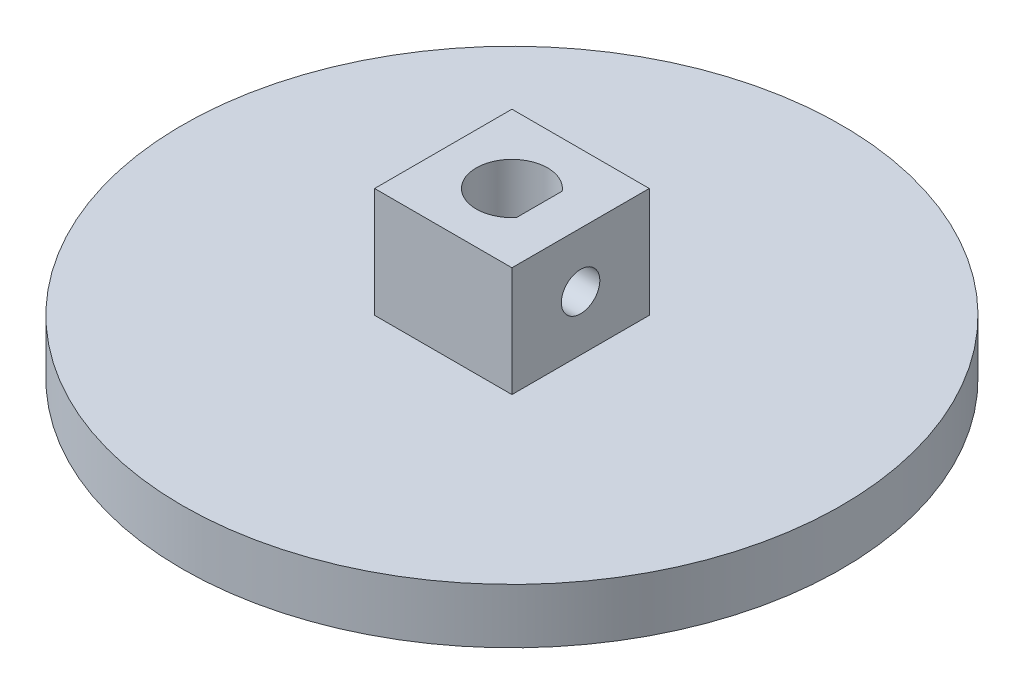
ISO-10303-21;
HEADER;
FILE_DESCRIPTION(('STEP AP214'),'2;1');
FILE_NAME('part.step','',(''),(''),'','','');
FILE_SCHEMA(('AUTOMOTIVE_DESIGN { 1 0 10303 214 1 1 1 1 }'));
ENDSEC;
DATA;
#1=APPLICATION_CONTEXT('core data for automotive mechanical design processes');
#2=APPLICATION_PROTOCOL_DEFINITION('international standard','automotive_design',2000,#1);
#3=PRODUCT_CONTEXT('',#1,'mechanical');
#4=PRODUCT('Part','Part','',(#3));
#5=PRODUCT_RELATED_PRODUCT_CATEGORY('part','',(#4));
#6=PRODUCT_DEFINITION_FORMATION('','',#4);
#7=PRODUCT_DEFINITION_CONTEXT('part definition',#1,'design');
#8=PRODUCT_DEFINITION('design','',#6,#7);
#9=PRODUCT_DEFINITION_SHAPE('','',#8);
#10=(LENGTH_UNIT() NAMED_UNIT(*) SI_UNIT(.MILLI.,.METRE.));
#11=(NAMED_UNIT(*) PLANE_ANGLE_UNIT() SI_UNIT($,.RADIAN.));
#12=(NAMED_UNIT(*) SI_UNIT($,.STERADIAN.) SOLID_ANGLE_UNIT());
#13=UNCERTAINTY_MEASURE_WITH_UNIT(LENGTH_MEASURE(1.E-05),#10,'distance_accuracy_value','');
#14=(GEOMETRIC_REPRESENTATION_CONTEXT(3) GLOBAL_UNCERTAINTY_ASSIGNED_CONTEXT((#13)) GLOBAL_UNIT_ASSIGNED_CONTEXT((#10,
#11,#12)) REPRESENTATION_CONTEXT('',''));
#15=CARTESIAN_POINT('',(0.,0.,0.));
#16=DIRECTION('',(0.,0.,1.));
#17=DIRECTION('',(1.,0.,0.));
#18=AXIS2_PLACEMENT_3D('',#15,#16,#17);
#19=CARTESIAN_POINT('',(0.,4.,0.));
#20=DIRECTION('',(0.,1.,0.));
#21=DIRECTION('',(0.,0.,1.));
#22=AXIS2_PLACEMENT_3D('',#19,#20,#21);
#23=PLANE('',#22);
#24=CARTESIAN_POINT('',(0.,4.,0.));
#25=DIRECTION('',(0.,1.,0.));
#26=DIRECTION('',(0.,0.,1.));
#27=AXIS2_PLACEMENT_3D('',#24,#25,#26);
#28=CIRCLE('',#27,24.);
#29=CARTESIAN_POINT('',(0.,4.,24.));
#30=VERTEX_POINT('',#29);
#31=EDGE_CURVE('E11',#30,#30,#28,.T.);
#32=ORIENTED_EDGE('',*,*,#31,.T.);
#33=EDGE_LOOP('',(#32));
#34=FACE_BOUND('',#33,.T.);
#35=DIRECTION('',(1.,0.,0.));
#36=VECTOR('',#35,1.);
#37=CARTESIAN_POINT('',(-5.,4.,5.));
#38=LINE('',#37,#36);
#39=CARTESIAN_POINT('',(-5.,4.,5.));
#40=VERTEX_POINT('',#39);
#41=CARTESIAN_POINT('',(5.,4.,5.));
#42=VERTEX_POINT('',#41);
#43=EDGE_CURVE('E128',#40,#42,#38,.T.);
#44=ORIENTED_EDGE('',*,*,#43,.F.);
#45=DIRECTION('',(0.,0.,1.));
#46=VECTOR('',#45,1.);
#47=CARTESIAN_POINT('',(-5.,4.,-5.));
#48=LINE('',#47,#46);
#49=CARTESIAN_POINT('',(-5.,4.,-5.));
#50=VERTEX_POINT('',#49);
#51=EDGE_CURVE('E114',#50,#40,#48,.T.);
#52=ORIENTED_EDGE('',*,*,#51,.F.);
#53=DIRECTION('',(-1.,0.,0.));
#54=VECTOR('',#53,1.);
#55=CARTESIAN_POINT('',(-5.,4.,-5.));
#56=LINE('',#55,#54);
#57=CARTESIAN_POINT('',(5.,4.,-5.));
#58=VERTEX_POINT('',#57);
#59=EDGE_CURVE('E119',#58,#50,#56,.T.);
#60=ORIENTED_EDGE('',*,*,#59,.F.);
#61=DIRECTION('',(0.,0.,-1.));
#62=VECTOR('',#61,1.);
#63=CARTESIAN_POINT('',(5.,4.,-5.));
#64=LINE('',#63,#62);
#65=EDGE_CURVE('E130',#42,#58,#64,.T.);
#66=ORIENTED_EDGE('',*,*,#65,.F.);
#67=EDGE_LOOP('',(#44,#52,#60,#66));
#68=FACE_BOUND('',#67,.T.);
#69=ADVANCED_FACE('F33',(#34,#68),#23,.T.);
#70=CARTESIAN_POINT('',(0.,0.,0.));
#71=DIRECTION('',(0.,1.,0.));
#72=DIRECTION('',(0.,0.,1.));
#73=AXIS2_PLACEMENT_3D('',#70,#71,#72);
#74=PLANE('',#73);
#75=CARTESIAN_POINT('',(0.,0.,0.));
#76=DIRECTION('',(0.,1.,0.));
#77=DIRECTION('',(0.,0.,1.));
#78=AXIS2_PLACEMENT_3D('',#75,#76,#77);
#79=CIRCLE('',#78,24.);
#80=CARTESIAN_POINT('',(0.,0.,24.));
#81=VERTEX_POINT('',#80);
#82=EDGE_CURVE('E42',#81,#81,#79,.T.);
#83=ORIENTED_EDGE('',*,*,#82,.F.);
#84=EDGE_LOOP('',(#83));
#85=FACE_BOUND('',#84,.T.);
#86=CARTESIAN_POINT('',(0.,0.,0.));
#87=DIRECTION('',(0.,-1.,0.));
#88=DIRECTION('',(0.,0.,-1.));
#89=AXIS2_PLACEMENT_3D('',#86,#87,#88);
#90=CIRCLE('',#89,2.6);
#91=CARTESIAN_POINT('',(2.,0.,1.66132477258362));
#92=VERTEX_POINT('',#91);
#93=CARTESIAN_POINT('',(2.,0.,-1.66132477258361));
#94=VERTEX_POINT('',#93);
#95=EDGE_CURVE('E93',#92,#94,#90,.T.);
#96=ORIENTED_EDGE('',*,*,#95,.F.);
#97=DIRECTION('',(0.,0.,-1.));
#98=VECTOR('',#97,1.);
#99=CARTESIAN_POINT('',(2.,0.,-1.5));
#100=LINE('',#99,#98);
#101=EDGE_CURVE('E89',#92,#94,#100,.T.);
#102=ORIENTED_EDGE('',*,*,#101,.T.);
#103=EDGE_LOOP('',(#96,#102));
#104=FACE_BOUND('',#103,.T.);
#105=ADVANCED_FACE('F91',(#85,#104),#74,.F.);
#106=CARTESIAN_POINT('',(0.,4.,0.));
#107=DIRECTION('',(0.,-1.,0.));
#108=DIRECTION('',(0.,0.,-1.));
#109=AXIS2_PLACEMENT_3D('',#106,#107,#108);
#110=CYLINDRICAL_SURFACE('',#109,24.);
#111=ORIENTED_EDGE('',*,*,#31,.F.);
#112=EDGE_LOOP('',(#111));
#113=FACE_BOUND('',#112,.T.);
#114=ORIENTED_EDGE('',*,*,#82,.T.);
#115=EDGE_LOOP('',(#114));
#116=FACE_BOUND('',#115,.T.);
#117=ADVANCED_FACE('F35',(#113,#116),#110,.T.);
#118=CARTESIAN_POINT('',(2.,4.,-1.5));
#119=DIRECTION('',(-1.,0.,0.));
#120=DIRECTION('',(0.,0.,1.));
#121=AXIS2_PLACEMENT_3D('',#118,#119,#120);
#122=PLANE('',#121);
#123=ORIENTED_EDGE('',*,*,#101,.F.);
#124=DIRECTION('',(0.,-1.,0.));
#125=VECTOR('',#124,1.);
#126=CARTESIAN_POINT('',(2.,12.,1.66132477258362));
#127=LINE('',#126,#125);
#128=CARTESIAN_POINT('',(2.,12.,1.66132477258362));
#129=VERTEX_POINT('',#128);
#130=EDGE_CURVE('E103',#129,#92,#127,.T.);
#131=ORIENTED_EDGE('',*,*,#130,.F.);
#132=DIRECTION('',(0.,0.,1.));
#133=VECTOR('',#132,1.);
#134=CARTESIAN_POINT('',(2.,12.,-1.66132477258361));
#135=LINE('',#134,#133);
#136=CARTESIAN_POINT('',(2.,12.,-1.66132477258361));
#137=VERTEX_POINT('',#136);
#138=EDGE_CURVE('E102',#137,#129,#135,.T.);
#139=ORIENTED_EDGE('',*,*,#138,.F.);
#140=DIRECTION('',(0.,-1.,0.));
#141=VECTOR('',#140,1.);
#142=CARTESIAN_POINT('',(2.,12.,-1.66132477258361));
#143=LINE('',#142,#141);
#144=EDGE_CURVE('E98',#137,#94,#143,.T.);
#145=ORIENTED_EDGE('',*,*,#144,.T.);
#146=EDGE_LOOP('',(#123,#131,#139,#145));
#147=FACE_BOUND('',#146,.T.);
#148=CARTESIAN_POINT('',(2.,8.,0.));
#149=DIRECTION('',(1.,0.,0.));
#150=DIRECTION('',(0.,0.,-1.));
#151=AXIS2_PLACEMENT_3D('',#148,#149,#150);
#152=CIRCLE('',#151,1.4);
#153=CARTESIAN_POINT('',(2.,8.,-1.4));
#154=VERTEX_POINT('',#153);
#155=EDGE_CURVE('E37',#154,#154,#152,.F.);
#156=ORIENTED_EDGE('',*,*,#155,.F.);
#157=EDGE_LOOP('',(#156));
#158=FACE_BOUND('',#157,.T.);
#159=ADVANCED_FACE('F99',(#147,#158),#122,.T.);
#160=CARTESIAN_POINT('',(-5.,12.,-5.));
#161=DIRECTION('',(1.,0.,0.));
#162=DIRECTION('',(0.,0.,-1.));
#163=AXIS2_PLACEMENT_3D('',#160,#161,#162);
#164=PLANE('',#163);
#165=ORIENTED_EDGE('',*,*,#51,.T.);
#166=DIRECTION('',(0.,-1.,0.));
#167=VECTOR('',#166,1.);
#168=CARTESIAN_POINT('',(-5.,12.,5.));
#169=LINE('',#168,#167);
#170=CARTESIAN_POINT('',(-5.,12.,5.));
#171=VERTEX_POINT('',#170);
#172=EDGE_CURVE('E95',#171,#40,#169,.T.);
#173=ORIENTED_EDGE('',*,*,#172,.F.);
#174=DIRECTION('',(0.,0.,1.));
#175=VECTOR('',#174,1.);
#176=CARTESIAN_POINT('',(-5.,12.,-5.));
#177=LINE('',#176,#175);
#178=CARTESIAN_POINT('',(-5.,12.,-5.));
#179=VERTEX_POINT('',#178);
#180=EDGE_CURVE('E115',#179,#171,#177,.T.);
#181=ORIENTED_EDGE('',*,*,#180,.F.);
#182=DIRECTION('',(0.,-1.,0.));
#183=VECTOR('',#182,1.);
#184=CARTESIAN_POINT('',(-5.,12.,-5.));
#185=LINE('',#184,#183);
#186=EDGE_CURVE('E125',#179,#50,#185,.T.);
#187=ORIENTED_EDGE('',*,*,#186,.T.);
#188=EDGE_LOOP('',(#165,#173,#181,#187));
#189=FACE_BOUND('',#188,.T.);
#190=ADVANCED_FACE('F154',(#189),#164,.F.);
#191=CARTESIAN_POINT('',(-5.,12.,5.));
#192=DIRECTION('',(0.,0.,-1.));
#193=DIRECTION('',(-1.,0.,0.));
#194=AXIS2_PLACEMENT_3D('',#191,#192,#193);
#195=PLANE('',#194);
#196=ORIENTED_EDGE('',*,*,#43,.T.);
#197=DIRECTION('',(0.,-1.,0.));
#198=VECTOR('',#197,1.);
#199=CARTESIAN_POINT('',(5.,12.,5.));
#200=LINE('',#199,#198);
#201=CARTESIAN_POINT('',(5.,12.,5.));
#202=VERTEX_POINT('',#201);
#203=EDGE_CURVE('E136',#202,#42,#200,.T.);
#204=ORIENTED_EDGE('',*,*,#203,.F.);
#205=DIRECTION('',(1.,0.,0.));
#206=VECTOR('',#205,1.);
#207=CARTESIAN_POINT('',(-5.,12.,5.));
#208=LINE('',#207,#206);
#209=EDGE_CURVE('E118',#171,#202,#208,.T.);
#210=ORIENTED_EDGE('',*,*,#209,.F.);
#211=ORIENTED_EDGE('',*,*,#172,.T.);
#212=EDGE_LOOP('',(#196,#204,#210,#211));
#213=FACE_BOUND('',#212,.T.);
#214=ADVANCED_FACE('F157',(#213),#195,.F.);
#215=CARTESIAN_POINT('',(5.,12.,-5.));
#216=DIRECTION('',(-1.,0.,0.));
#217=DIRECTION('',(0.,0.,1.));
#218=AXIS2_PLACEMENT_3D('',#215,#216,#217);
#219=PLANE('',#218);
#220=CARTESIAN_POINT('',(5.,8.,0.));
#221=DIRECTION('',(1.,0.,0.));
#222=DIRECTION('',(0.,0.,-1.));
#223=AXIS2_PLACEMENT_3D('',#220,#221,#222);
#224=CIRCLE('',#223,1.4);
#225=CARTESIAN_POINT('',(5.,8.,-1.4));
#226=VERTEX_POINT('',#225);
#227=EDGE_CURVE('E111',#226,#226,#224,.T.);
#228=ORIENTED_EDGE('',*,*,#227,.F.);
#229=EDGE_LOOP('',(#228));
#230=FACE_BOUND('',#229,.T.);
#231=ORIENTED_EDGE('',*,*,#65,.T.);
#232=DIRECTION('',(0.,-1.,0.));
#233=VECTOR('',#232,1.);
#234=CARTESIAN_POINT('',(5.,12.,-5.));
#235=LINE('',#234,#233);
#236=CARTESIAN_POINT('',(5.,12.,-5.));
#237=VERTEX_POINT('',#236);
#238=EDGE_CURVE('E58',#237,#58,#235,.T.);
#239=ORIENTED_EDGE('',*,*,#238,.F.);
#240=DIRECTION('',(0.,0.,-1.));
#241=VECTOR('',#240,1.);
#242=CARTESIAN_POINT('',(5.,12.,-5.));
#243=LINE('',#242,#241);
#244=EDGE_CURVE('E121',#202,#237,#243,.T.);
#245=ORIENTED_EDGE('',*,*,#244,.F.);
#246=ORIENTED_EDGE('',*,*,#203,.T.);
#247=EDGE_LOOP('',(#231,#239,#245,#246));
#248=FACE_BOUND('',#247,.T.);
#249=ADVANCED_FACE('F161',(#230,#248),#219,.F.);
#250=CARTESIAN_POINT('',(-5.,12.,-5.));
#251=DIRECTION('',(0.,0.,1.));
#252=DIRECTION('',(1.,0.,0.));
#253=AXIS2_PLACEMENT_3D('',#250,#251,#252);
#254=PLANE('',#253);
#255=ORIENTED_EDGE('',*,*,#59,.T.);
#256=ORIENTED_EDGE('',*,*,#186,.F.);
#257=DIRECTION('',(-1.,0.,0.));
#258=VECTOR('',#257,1.);
#259=CARTESIAN_POINT('',(-5.,12.,-5.));
#260=LINE('',#259,#258);
#261=EDGE_CURVE('E123',#237,#179,#260,.T.);
#262=ORIENTED_EDGE('',*,*,#261,.F.);
#263=ORIENTED_EDGE('',*,*,#238,.T.);
#264=EDGE_LOOP('',(#255,#256,#262,#263));
#265=FACE_BOUND('',#264,.T.);
#266=ADVANCED_FACE('F165',(#265),#254,.F.);
#267=CARTESIAN_POINT('',(0.,12.,0.));
#268=DIRECTION('',(0.,1.,0.));
#269=DIRECTION('',(0.,0.,1.));
#270=AXIS2_PLACEMENT_3D('',#267,#268,#269);
#271=PLANE('',#270);
#272=CARTESIAN_POINT('',(0.,12.,0.));
#273=DIRECTION('',(0.,-1.,0.));
#274=DIRECTION('',(0.,0.,-1.));
#275=AXIS2_PLACEMENT_3D('',#272,#273,#274);
#276=CIRCLE('',#275,2.6);
#277=EDGE_CURVE('E50',#129,#137,#276,.T.);
#278=ORIENTED_EDGE('',*,*,#277,.T.);
#279=ORIENTED_EDGE('',*,*,#138,.T.);
#280=EDGE_LOOP('',(#278,#279));
#281=FACE_BOUND('',#280,.T.);
#282=ORIENTED_EDGE('',*,*,#180,.T.);
#283=ORIENTED_EDGE('',*,*,#209,.T.);
#284=ORIENTED_EDGE('',*,*,#244,.T.);
#285=ORIENTED_EDGE('',*,*,#261,.T.);
#286=EDGE_LOOP('',(#282,#283,#284,#285));
#287=FACE_BOUND('',#286,.T.);
#288=ADVANCED_FACE('F169',(#281,#287),#271,.T.);
#289=CARTESIAN_POINT('',(0.999999999999999,8.,0.));
#290=DIRECTION('',(1.,0.,0.));
#291=DIRECTION('',(0.,0.,-1.));
#292=AXIS2_PLACEMENT_3D('',#289,#290,#291);
#293=CYLINDRICAL_SURFACE('',#292,1.4);
#294=ORIENTED_EDGE('',*,*,#155,.T.);
#295=EDGE_LOOP('',(#294));
#296=FACE_BOUND('',#295,.T.);
#297=ORIENTED_EDGE('',*,*,#227,.T.);
#298=EDGE_LOOP('',(#297));
#299=FACE_BOUND('',#298,.T.);
#300=ADVANCED_FACE('F172',(#296,#299),#293,.F.);
#301=CARTESIAN_POINT('',(0.,12.,0.));
#302=DIRECTION('',(0.,-1.,0.));
#303=DIRECTION('',(0.,0.,-1.));
#304=AXIS2_PLACEMENT_3D('',#301,#302,#303);
#305=CYLINDRICAL_SURFACE('',#304,2.6);
#306=ORIENTED_EDGE('',*,*,#144,.F.);
#307=ORIENTED_EDGE('',*,*,#277,.F.);
#308=ORIENTED_EDGE('',*,*,#130,.T.);
#309=ORIENTED_EDGE('',*,*,#95,.T.);
#310=EDGE_LOOP('',(#306,#307,#308,#309));
#311=FACE_BOUND('',#310,.T.);
#312=ADVANCED_FACE('F105',(#311),#305,.F.);
#313=CLOSED_SHELL('',(#69,#105,#117,#159,#190,#214,#249,#266,#288,#300,#312));
#314=MANIFOLD_SOLID_BREP('B2',#313);
#315=ADVANCED_BREP_SHAPE_REPRESENTATION('',(#18,#314),#14);
#316=SHAPE_DEFINITION_REPRESENTATION(#9,#315);
ENDSEC;
END-ISO-10303-21;
